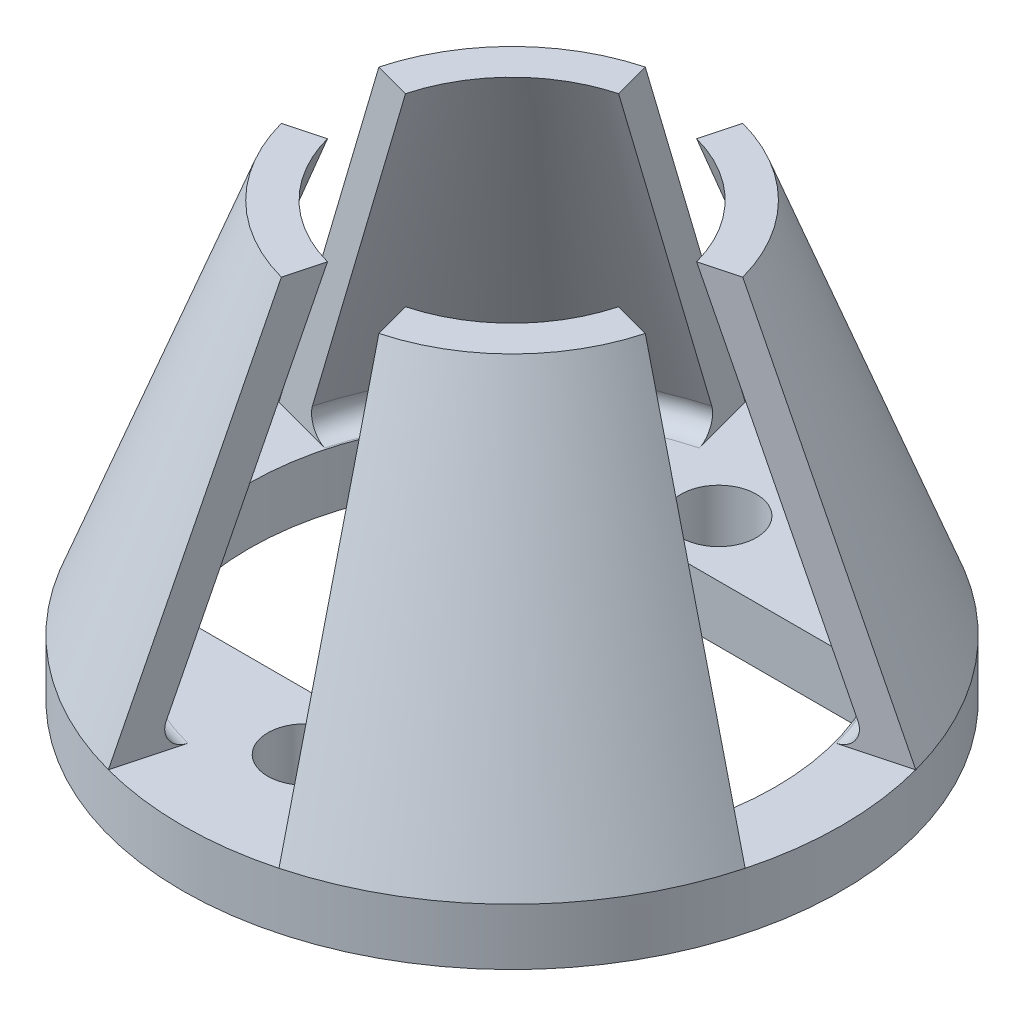
ISO-10303-21;
HEADER;
FILE_DESCRIPTION(('STEP AP214'),'2;1');
FILE_NAME('part.step','',(''),(''),'','','');
FILE_SCHEMA(('AUTOMOTIVE_DESIGN { 1 0 10303 214 1 1 1 1 }'));
ENDSEC;
DATA;
#1=APPLICATION_CONTEXT('core data for automotive mechanical design processes');
#2=APPLICATION_PROTOCOL_DEFINITION('international standard','automotive_design',2000,#1);
#3=PRODUCT_CONTEXT('',#1,'mechanical');
#4=PRODUCT('Part','Part','',(#3));
#5=PRODUCT_RELATED_PRODUCT_CATEGORY('part','',(#4));
#6=PRODUCT_DEFINITION_FORMATION('','',#4);
#7=PRODUCT_DEFINITION_CONTEXT('part definition',#1,'design');
#8=PRODUCT_DEFINITION('design','',#6,#7);
#9=PRODUCT_DEFINITION_SHAPE('','',#8);
#10=(LENGTH_UNIT() NAMED_UNIT(*) SI_UNIT(.MILLI.,.METRE.));
#11=(NAMED_UNIT(*) PLANE_ANGLE_UNIT() SI_UNIT($,.RADIAN.));
#12=(NAMED_UNIT(*) SI_UNIT($,.STERADIAN.) SOLID_ANGLE_UNIT());
#13=UNCERTAINTY_MEASURE_WITH_UNIT(LENGTH_MEASURE(1.E-05),#10,'distance_accuracy_value','');
#14=(GEOMETRIC_REPRESENTATION_CONTEXT(3) GLOBAL_UNCERTAINTY_ASSIGNED_CONTEXT((#13)) GLOBAL_UNIT_ASSIGNED_CONTEXT((#10,
#11,#12)) REPRESENTATION_CONTEXT('',''));
#15=CARTESIAN_POINT('',(0.,0.,0.));
#16=DIRECTION('',(0.,0.,1.));
#17=DIRECTION('',(1.,0.,0.));
#18=AXIS2_PLACEMENT_3D('',#15,#16,#17);
#19=CARTESIAN_POINT('',(0.,3.,0.));
#20=DIRECTION('',(0.,1.,0.));
#21=DIRECTION('',(0.,0.,1.));
#22=AXIS2_PLACEMENT_3D('',#19,#20,#21);
#23=PLANE('',#22);
#24=CARTESIAN_POINT('',(0.,3.,0.));
#25=DIRECTION('',(0.,1.,0.));
#26=DIRECTION('',(0.,0.,1.));
#27=AXIS2_PLACEMENT_3D('',#24,#25,#26);
#28=CIRCLE('',#27,13.97);
#29=CARTESIAN_POINT('',(11.4734476074108,3.,7.97));
#30=VERTEX_POINT('',#29);
#31=CARTESIAN_POINT('',(11.4734476074108,3.,-7.97));
#32=VERTEX_POINT('',#31);
#33=EDGE_CURVE('E930',#30,#32,#28,.T.);
#34=ORIENTED_EDGE('',*,*,#33,.F.);
#35=DIRECTION('',(1.,0.,0.));
#36=VECTOR('',#35,1.);
#37=CARTESIAN_POINT('',(0.,3.,7.97));
#38=LINE('',#37,#36);
#39=CARTESIAN_POINT('',(-11.4734476074108,3.,7.97));
#40=VERTEX_POINT('',#39);
#41=EDGE_CURVE('E953',#40,#30,#38,.T.);
#42=ORIENTED_EDGE('',*,*,#41,.F.);
#43=CARTESIAN_POINT('',(-11.4734476074108,3.,-7.97));
#44=VERTEX_POINT('',#43);
#45=EDGE_CURVE('E952',#44,#40,#28,.T.);
#46=ORIENTED_EDGE('',*,*,#45,.F.);
#47=DIRECTION('',(1.,0.,0.));
#48=VECTOR('',#47,1.);
#49=CARTESIAN_POINT('',(0.,3.,-7.97));
#50=LINE('',#49,#48);
#51=EDGE_CURVE('E949',#44,#32,#50,.T.);
#52=ORIENTED_EDGE('',*,*,#51,.T.);
#53=EDGE_LOOP('',(#34,#42,#46,#52));
#54=FACE_BOUND('',#53,.T.);
#55=CARTESIAN_POINT('',(0.,3.,-10.97));
#56=DIRECTION('',(0.,1.,0.));
#57=DIRECTION('',(0.,0.,1.));
#58=AXIS2_PLACEMENT_3D('',#55,#56,#57);
#59=CIRCLE('',#58,2.);
#60=CARTESIAN_POINT('',(0.,3.,-8.97));
#61=VERTEX_POINT('',#60);
#62=EDGE_CURVE('E651',#61,#61,#59,.T.);
#63=ORIENTED_EDGE('',*,*,#62,.F.);
#64=EDGE_LOOP('',(#63));
#65=FACE_BOUND('',#64,.T.);
#66=CARTESIAN_POINT('',(0.,3.,10.97));
#67=DIRECTION('',(0.,1.,0.));
#68=DIRECTION('',(0.,0.,1.));
#69=AXIS2_PLACEMENT_3D('',#66,#67,#68);
#70=CIRCLE('',#69,2.);
#71=CARTESIAN_POINT('',(0.,3.,12.97));
#72=VERTEX_POINT('',#71);
#73=EDGE_CURVE('E925',#72,#72,#70,.T.);
#74=ORIENTED_EDGE('',*,*,#73,.F.);
#75=EDGE_LOOP('',(#74));
#76=FACE_BOUND('',#75,.T.);
#77=CARTESIAN_POINT('',(0.,3.,0.));
#78=DIRECTION('',(0.,1.,0.));
#79=DIRECTION('',(0.,0.,1.));
#80=AXIS2_PLACEMENT_3D('',#77,#78,#79);
#81=CIRCLE('',#80,14.0569995318353);
#82=CARTESIAN_POINT('',(13.5780188879331,3.,-3.63821919583621));
#83=VERTEX_POINT('',#82);
#84=CARTESIAN_POINT('',(3.6382191958362,3.,-13.5780188879331));
#85=VERTEX_POINT('',#84);
#86=EDGE_CURVE('E872',#83,#85,#81,.T.);
#87=ORIENTED_EDGE('',*,*,#86,.T.);
#88=DIRECTION('',(0.258819045102521,0.,-0.965925826289068));
#89=VECTOR('',#88,1.);
#90=CARTESIAN_POINT('',(0.,3.,0.));
#91=LINE('',#90,#89);
#92=CARTESIAN_POINT('',(4.52933328929412,3.,-16.9037019600587));
#93=VERTEX_POINT('',#92);
#94=EDGE_CURVE('E654',#85,#93,#91,.T.);
#95=ORIENTED_EDGE('',*,*,#94,.T.);
#96=CARTESIAN_POINT('',(0.,3.,0.));
#97=DIRECTION('',(0.,1.,0.));
#98=DIRECTION('',(0.,0.,1.));
#99=AXIS2_PLACEMENT_3D('',#96,#97,#98);
#100=CIRCLE('',#99,17.5);
#101=CARTESIAN_POINT('',(-4.52933328929412,3.,-16.9037019600587));
#102=VERTEX_POINT('',#101);
#103=EDGE_CURVE('E632',#93,#102,#100,.T.);
#104=ORIENTED_EDGE('',*,*,#103,.T.);
#105=DIRECTION('',(0.258819045102521,0.,0.965925826289068));
#106=VECTOR('',#105,1.);
#107=CARTESIAN_POINT('',(0.,3.,0.));
#108=LINE('',#107,#106);
#109=CARTESIAN_POINT('',(-3.6382191958362,3.,-13.5780188879331));
#110=VERTEX_POINT('',#109);
#111=EDGE_CURVE('E690',#110,#102,#108,.F.);
#112=ORIENTED_EDGE('',*,*,#111,.F.);
#113=CARTESIAN_POINT('',(0.,3.,0.));
#114=DIRECTION('',(0.,1.,0.));
#115=DIRECTION('',(0.,0.,1.));
#116=AXIS2_PLACEMENT_3D('',#113,#114,#115);
#117=CIRCLE('',#116,14.0569995318353);
#118=CARTESIAN_POINT('',(-13.5780188879331,3.,-3.63821919583621));
#119=VERTEX_POINT('',#118);
#120=EDGE_CURVE('E874',#110,#119,#117,.T.);
#121=ORIENTED_EDGE('',*,*,#120,.T.);
#122=DIRECTION('',(-0.965925826289068,0.,-0.258819045102521));
#123=VECTOR('',#122,1.);
#124=CARTESIAN_POINT('',(-14.9718503074806,3.,-4.01169519908908));
#125=LINE('',#124,#123);
#126=CARTESIAN_POINT('',(-16.9037019600587,3.,-4.52933328929413));
#127=VERTEX_POINT('',#126);
#128=EDGE_CURVE('E709',#119,#127,#125,.T.);
#129=ORIENTED_EDGE('',*,*,#128,.T.);
#130=CARTESIAN_POINT('',(-16.9037019600587,3.,4.52933328929412));
#131=VERTEX_POINT('',#130);
#132=EDGE_CURVE('E323',#127,#131,#100,.T.);
#133=ORIENTED_EDGE('',*,*,#132,.T.);
#134=DIRECTION('',(0.965925826289068,0.,-0.258819045102521));
#135=VECTOR('',#134,1.);
#136=CARTESIAN_POINT('',(0.,3.,0.));
#137=LINE('',#136,#135);
#138=CARTESIAN_POINT('',(-13.5780188879331,3.,3.6382191958362));
#139=VERTEX_POINT('',#138);
#140=EDGE_CURVE('E344',#139,#131,#137,.F.);
#141=ORIENTED_EDGE('',*,*,#140,.F.);
#142=CARTESIAN_POINT('',(0.,3.,0.));
#143=DIRECTION('',(0.,1.,0.));
#144=DIRECTION('',(0.,0.,1.));
#145=AXIS2_PLACEMENT_3D('',#142,#143,#144);
#146=CIRCLE('',#145,14.0569995318353);
#147=CARTESIAN_POINT('',(-3.6382191958362,3.,13.5780188879331));
#148=VERTEX_POINT('',#147);
#149=EDGE_CURVE('E330',#139,#148,#146,.T.);
#150=ORIENTED_EDGE('',*,*,#149,.T.);
#151=DIRECTION('',(-0.258819045102522,0.,0.965925826289068));
#152=VECTOR('',#151,1.);
#153=CARTESIAN_POINT('',(-4.01169519908908,3.,14.9718503074806));
#154=LINE('',#153,#152);
#155=CARTESIAN_POINT('',(-4.52933328929412,3.,16.9037019600587));
#156=VERTEX_POINT('',#155);
#157=EDGE_CURVE('E327',#148,#156,#154,.T.);
#158=ORIENTED_EDGE('',*,*,#157,.T.);
#159=CARTESIAN_POINT('',(4.52933328929412,3.,16.9037019600587));
#160=VERTEX_POINT('',#159);
#161=EDGE_CURVE('E309',#156,#160,#100,.T.);
#162=ORIENTED_EDGE('',*,*,#161,.T.);
#163=DIRECTION('',(0.258819045102521,0.,0.965925826289068));
#164=VECTOR('',#163,1.);
#165=CARTESIAN_POINT('',(0.,3.,0.));
#166=LINE('',#165,#164);
#167=CARTESIAN_POINT('',(3.6382191958362,3.,13.5780188879331));
#168=VERTEX_POINT('',#167);
#169=EDGE_CURVE('E608',#168,#160,#166,.T.);
#170=ORIENTED_EDGE('',*,*,#169,.F.);
#171=CARTESIAN_POINT('',(0.,3.,0.));
#172=DIRECTION('',(0.,1.,0.));
#173=DIRECTION('',(0.,0.,1.));
#174=AXIS2_PLACEMENT_3D('',#171,#172,#173);
#175=CIRCLE('',#174,14.0569995318353);
#176=CARTESIAN_POINT('',(13.5780188879331,3.,3.6382191958362));
#177=VERTEX_POINT('',#176);
#178=EDGE_CURVE('E894',#168,#177,#175,.T.);
#179=ORIENTED_EDGE('',*,*,#178,.T.);
#180=DIRECTION('',(0.965925826289068,0.,0.258819045102521));
#181=VECTOR('',#180,1.);
#182=CARTESIAN_POINT('',(0.,3.,0.));
#183=LINE('',#182,#181);
#184=CARTESIAN_POINT('',(16.9037019600587,3.,4.52933328929412));
#185=VERTEX_POINT('',#184);
#186=EDGE_CURVE('E483',#177,#185,#183,.T.);
#187=ORIENTED_EDGE('',*,*,#186,.T.);
#188=CARTESIAN_POINT('',(16.9037019600587,3.,-4.52933328929413));
#189=VERTEX_POINT('',#188);
#190=EDGE_CURVE('E324',#185,#189,#100,.T.);
#191=ORIENTED_EDGE('',*,*,#190,.T.);
#192=DIRECTION('',(0.965925826289068,0.,-0.258819045102521));
#193=VECTOR('',#192,1.);
#194=CARTESIAN_POINT('',(0.,3.,0.));
#195=LINE('',#194,#193);
#196=EDGE_CURVE('E603',#83,#189,#195,.T.);
#197=ORIENTED_EDGE('',*,*,#196,.F.);
#198=EDGE_LOOP('',(#87,#95,#104,#112,#121,#129,#133,#141,#150,#158,#162,#170,#179,#187,#191,#197));
#199=FACE_BOUND('',#198,.T.);
#200=ADVANCED_FACE('F149',(#54,#65,#76,#199),#23,.T.);
#201=CARTESIAN_POINT('',(0.,1.5,7.97));
#202=DIRECTION('',(0.,0.,-1.));
#203=DIRECTION('',(-1.,0.,0.));
#204=AXIS2_PLACEMENT_3D('',#201,#202,#203);
#205=PLANE('',#204);
#206=DIRECTION('',(1.,0.,0.));
#207=VECTOR('',#206,1.);
#208=CARTESIAN_POINT('',(0.,0.,7.97));
#209=LINE('',#208,#207);
#210=CARTESIAN_POINT('',(-11.4734476074108,0.,7.97));
#211=VERTEX_POINT('',#210);
#212=CARTESIAN_POINT('',(11.4734476074108,0.,7.97));
#213=VERTEX_POINT('',#212);
#214=EDGE_CURVE('E908',#211,#213,#209,.T.);
#215=ORIENTED_EDGE('',*,*,#214,.F.);
#216=DIRECTION('',(0.,-1.,0.));
#217=VECTOR('',#216,1.);
#218=CARTESIAN_POINT('',(-11.4734476074108,1.5,7.97));
#219=LINE('',#218,#217);
#220=EDGE_CURVE('E637',#40,#211,#219,.T.);
#221=ORIENTED_EDGE('',*,*,#220,.F.);
#222=ORIENTED_EDGE('',*,*,#41,.T.);
#223=DIRECTION('',(0.,-1.,0.));
#224=VECTOR('',#223,1.);
#225=CARTESIAN_POINT('',(11.4734476074108,1.5,7.97));
#226=LINE('',#225,#224);
#227=EDGE_CURVE('E902',#30,#213,#226,.T.);
#228=ORIENTED_EDGE('',*,*,#227,.T.);
#229=EDGE_LOOP('',(#215,#221,#222,#228));
#230=FACE_BOUND('',#229,.T.);
#231=ADVANCED_FACE('F752',(#230),#205,.T.);
#232=CARTESIAN_POINT('',(0.,1.5,10.97));
#233=DIRECTION('',(0.,-1.,0.));
#234=DIRECTION('',(0.,0.,-1.));
#235=AXIS2_PLACEMENT_3D('',#232,#233,#234);
#236=CYLINDRICAL_SURFACE('',#235,2.);
#237=CARTESIAN_POINT('',(0.,0.,10.97));
#238=DIRECTION('',(0.,1.,0.));
#239=DIRECTION('',(0.,0.,1.));
#240=AXIS2_PLACEMENT_3D('',#237,#238,#239);
#241=CIRCLE('',#240,2.);
#242=CARTESIAN_POINT('',(0.,0.,12.97));
#243=VERTEX_POINT('',#242);
#244=EDGE_CURVE('E913',#243,#243,#241,.T.);
#245=ORIENTED_EDGE('',*,*,#244,.F.);
#246=EDGE_LOOP('',(#245));
#247=FACE_BOUND('',#246,.T.);
#248=ORIENTED_EDGE('',*,*,#73,.T.);
#249=EDGE_LOOP('',(#248));
#250=FACE_BOUND('',#249,.T.);
#251=ADVANCED_FACE('F750',(#247,#250),#236,.F.);
#252=CARTESIAN_POINT('',(0.,0.,0.));
#253=DIRECTION('',(0.,1.,0.));
#254=DIRECTION('',(0.,0.,1.));
#255=AXIS2_PLACEMENT_3D('',#252,#253,#254);
#256=PLANE('',#255);
#257=CARTESIAN_POINT('',(0.,0.,0.));
#258=DIRECTION('',(0.,1.,0.));
#259=DIRECTION('',(0.,0.,1.));
#260=AXIS2_PLACEMENT_3D('',#257,#258,#259);
#261=CIRCLE('',#260,13.97);
#262=CARTESIAN_POINT('',(11.4734476074108,0.,-7.97));
#263=VERTEX_POINT('',#262);
#264=EDGE_CURVE('E830',#213,#263,#261,.T.);
#265=ORIENTED_EDGE('',*,*,#264,.T.);
#266=DIRECTION('',(1.,0.,0.));
#267=VECTOR('',#266,1.);
#268=CARTESIAN_POINT('',(0.,0.,-7.97));
#269=LINE('',#268,#267);
#270=CARTESIAN_POINT('',(-11.4734476074108,0.,-7.97));
#271=VERTEX_POINT('',#270);
#272=EDGE_CURVE('E935',#271,#263,#269,.T.);
#273=ORIENTED_EDGE('',*,*,#272,.F.);
#274=EDGE_CURVE('E939',#271,#211,#261,.T.);
#275=ORIENTED_EDGE('',*,*,#274,.T.);
#276=ORIENTED_EDGE('',*,*,#214,.T.);
#277=EDGE_LOOP('',(#265,#273,#275,#276));
#278=FACE_BOUND('',#277,.T.);
#279=ORIENTED_EDGE('',*,*,#244,.T.);
#280=EDGE_LOOP('',(#279));
#281=FACE_BOUND('',#280,.T.);
#282=CARTESIAN_POINT('',(0.,0.,0.));
#283=DIRECTION('',(0.,1.,0.));
#284=DIRECTION('',(0.,0.,1.));
#285=AXIS2_PLACEMENT_3D('',#282,#283,#284);
#286=CIRCLE('',#285,17.5);
#287=CARTESIAN_POINT('',(0.,0.,17.5));
#288=VERTEX_POINT('',#287);
#289=EDGE_CURVE('E931',#288,#288,#286,.T.);
#290=ORIENTED_EDGE('',*,*,#289,.F.);
#291=EDGE_LOOP('',(#290));
#292=FACE_BOUND('',#291,.T.);
#293=CARTESIAN_POINT('',(0.,0.,-10.97));
#294=DIRECTION('',(0.,1.,0.));
#295=DIRECTION('',(0.,0.,1.));
#296=AXIS2_PLACEMENT_3D('',#293,#294,#295);
#297=CIRCLE('',#296,2.);
#298=CARTESIAN_POINT('',(0.,0.,-8.97));
#299=VERTEX_POINT('',#298);
#300=EDGE_CURVE('E926',#299,#299,#297,.T.);
#301=ORIENTED_EDGE('',*,*,#300,.T.);
#302=EDGE_LOOP('',(#301));
#303=FACE_BOUND('',#302,.T.);
#304=ADVANCED_FACE('F747',(#278,#281,#292,#303),#256,.F.);
#305=CARTESIAN_POINT('',(0.,3.,0.));
#306=DIRECTION('',(0.,-1.,0.));
#307=DIRECTION('',(0.,0.,-1.));
#308=AXIS2_PLACEMENT_3D('',#305,#306,#307);
#309=CYLINDRICAL_SURFACE('',#308,13.97);
#310=ORIENTED_EDGE('',*,*,#264,.F.);
#311=ORIENTED_EDGE('',*,*,#227,.F.);
#312=ORIENTED_EDGE('',*,*,#33,.T.);
#313=DIRECTION('',(0.,-1.,0.));
#314=VECTOR('',#313,1.);
#315=CARTESIAN_POINT('',(11.4734476074108,3.,-7.97));
#316=LINE('',#315,#314);
#317=EDGE_CURVE('E922',#32,#263,#316,.T.);
#318=ORIENTED_EDGE('',*,*,#317,.T.);
#319=EDGE_LOOP('',(#310,#311,#312,#318));
#320=FACE_BOUND('',#319,.T.);
#321=ADVANCED_FACE('F745',(#320),#309,.F.);
#322=ORIENTED_EDGE('',*,*,#274,.F.);
#323=DIRECTION('',(0.,-1.,0.));
#324=VECTOR('',#323,1.);
#325=CARTESIAN_POINT('',(-11.4734476074108,3.,-7.97));
#326=LINE('',#325,#324);
#327=EDGE_CURVE('E919',#44,#271,#326,.T.);
#328=ORIENTED_EDGE('',*,*,#327,.F.);
#329=ORIENTED_EDGE('',*,*,#45,.T.);
#330=ORIENTED_EDGE('',*,*,#220,.T.);
#331=EDGE_LOOP('',(#322,#328,#329,#330));
#332=FACE_BOUND('',#331,.T.);
#333=ADVANCED_FACE('F742',(#332),#309,.F.);
#334=CARTESIAN_POINT('',(0.,3.,-10.97));
#335=DIRECTION('',(0.,-1.,0.));
#336=DIRECTION('',(0.,0.,-1.));
#337=AXIS2_PLACEMENT_3D('',#334,#335,#336);
#338=CYLINDRICAL_SURFACE('',#337,2.);
#339=ORIENTED_EDGE('',*,*,#62,.T.);
#340=EDGE_LOOP('',(#339));
#341=FACE_BOUND('',#340,.T.);
#342=ORIENTED_EDGE('',*,*,#300,.F.);
#343=EDGE_LOOP('',(#342));
#344=FACE_BOUND('',#343,.T.);
#345=ADVANCED_FACE('F735',(#341,#344),#338,.F.);
#346=CARTESIAN_POINT('',(0.,3.,0.));
#347=DIRECTION('',(0.,-1.,0.));
#348=DIRECTION('',(0.,0.,-1.));
#349=AXIS2_PLACEMENT_3D('',#346,#347,#348);
#350=CYLINDRICAL_SURFACE('',#349,17.5);
#351=CARTESIAN_POINT('',(0.,3.,0.));
#352=DIRECTION('',(0.,-1.,0.));
#353=DIRECTION('',(0.,0.,-1.));
#354=AXIS2_PLACEMENT_3D('',#351,#352,#353);
#355=CIRCLE('',#354,17.5);
#356=EDGE_CURVE('E648',#189,#93,#355,.F.);
#357=ORIENTED_EDGE('',*,*,#356,.F.);
#358=ORIENTED_EDGE('',*,*,#190,.F.);
#359=CARTESIAN_POINT('',(0.,3.,0.));
#360=DIRECTION('',(0.,1.,0.));
#361=DIRECTION('',(0.,0.,1.));
#362=AXIS2_PLACEMENT_3D('',#359,#360,#361);
#363=CIRCLE('',#362,17.5);
#364=EDGE_CURVE('E319',#160,#185,#363,.T.);
#365=ORIENTED_EDGE('',*,*,#364,.F.);
#366=ORIENTED_EDGE('',*,*,#161,.F.);
#367=CARTESIAN_POINT('',(0.,3.,0.));
#368=DIRECTION('',(0.,1.,0.));
#369=DIRECTION('',(-0.965925826289068,0.,0.258819045102521));
#370=AXIS2_PLACEMENT_3D('',#367,#368,#369);
#371=CIRCLE('',#370,17.5);
#372=EDGE_CURVE('E315',#131,#156,#371,.T.);
#373=ORIENTED_EDGE('',*,*,#372,.F.);
#374=ORIENTED_EDGE('',*,*,#132,.F.);
#375=CARTESIAN_POINT('',(0.,3.,0.));
#376=DIRECTION('',(0.,1.,0.));
#377=DIRECTION('',(-0.258819045102521,0.,-0.965925826289068));
#378=AXIS2_PLACEMENT_3D('',#375,#376,#377);
#379=CIRCLE('',#378,17.5);
#380=EDGE_CURVE('E686',#102,#127,#379,.T.);
#381=ORIENTED_EDGE('',*,*,#380,.F.);
#382=ORIENTED_EDGE('',*,*,#103,.F.);
#383=EDGE_LOOP('',(#357,#358,#365,#366,#373,#374,#381,#382));
#384=FACE_BOUND('',#383,.T.);
#385=ORIENTED_EDGE('',*,*,#289,.T.);
#386=EDGE_LOOP('',(#385));
#387=FACE_BOUND('',#386,.T.);
#388=ADVANCED_FACE('F312',(#384,#387),#350,.T.);
#389=CARTESIAN_POINT('',(0.,3.,-7.97));
#390=DIRECTION('',(0.,0.,-1.));
#391=DIRECTION('',(-1.,0.,0.));
#392=AXIS2_PLACEMENT_3D('',#389,#390,#391);
#393=PLANE('',#392);
#394=ORIENTED_EDGE('',*,*,#327,.T.);
#395=ORIENTED_EDGE('',*,*,#272,.T.);
#396=ORIENTED_EDGE('',*,*,#317,.F.);
#397=ORIENTED_EDGE('',*,*,#51,.F.);
#398=EDGE_LOOP('',(#394,#395,#396,#397));
#399=FACE_BOUND('',#398,.T.);
#400=ADVANCED_FACE('F734',(#399),#393,.F.);
#401=CARTESIAN_POINT('',(0.,23.,0.));
#402=DIRECTION('',(0.,1.,0.));
#403=DIRECTION('',(0.,0.,1.));
#404=AXIS2_PLACEMENT_3D('',#401,#402,#403);
#405=PLANE('',#404);
#406=DIRECTION('',(0.965925826289068,0.,-0.258819045102521));
#407=VECTOR('',#406,1.);
#408=CARTESIAN_POINT('',(0.,23.,0.));
#409=LINE('',#408,#407);
#410=CARTESIAN_POINT('',(7.72740661031255,23.,-2.07055236082017));
#411=VERTEX_POINT('',#410);
#412=CARTESIAN_POINT('',(9.65925826289068,23.,-2.58819045102522));
#413=VERTEX_POINT('',#412);
#414=EDGE_CURVE('E813',#411,#413,#409,.T.);
#415=ORIENTED_EDGE('',*,*,#414,.T.);
#416=CARTESIAN_POINT('',(0.,23.,0.));
#417=DIRECTION('',(0.,1.,0.));
#418=DIRECTION('',(0.,0.,1.));
#419=AXIS2_PLACEMENT_3D('',#416,#417,#418);
#420=CIRCLE('',#419,10.);
#421=CARTESIAN_POINT('',(2.5881904510252,23.,-9.65925826289068));
#422=VERTEX_POINT('',#421);
#423=EDGE_CURVE('E678',#413,#422,#420,.T.);
#424=ORIENTED_EDGE('',*,*,#423,.T.);
#425=DIRECTION('',(0.258819045102521,0.,-0.965925826289068));
#426=VECTOR('',#425,1.);
#427=CARTESIAN_POINT('',(0.,23.,0.));
#428=LINE('',#427,#426);
#429=CARTESIAN_POINT('',(2.07055236082017,23.,-7.72740661031255));
#430=VERTEX_POINT('',#429);
#431=EDGE_CURVE('E812',#430,#422,#428,.T.);
#432=ORIENTED_EDGE('',*,*,#431,.F.);
#433=CARTESIAN_POINT('',(0.,23.,0.));
#434=DIRECTION('',(0.,1.,0.));
#435=DIRECTION('',(0.,0.,1.));
#436=AXIS2_PLACEMENT_3D('',#433,#434,#435);
#437=CIRCLE('',#436,8.);
#438=EDGE_CURVE('E817',#411,#430,#437,.T.);
#439=ORIENTED_EDGE('',*,*,#438,.F.);
#440=EDGE_LOOP('',(#415,#424,#432,#439));
#441=FACE_BOUND('',#440,.T.);
#442=ADVANCED_FACE('F740',(#441),#405,.T.);
#443=CARTESIAN_POINT('',(0.,3.,0.));
#444=DIRECTION('',(0.,-1.,0.));
#445=DIRECTION('',(0.,0.,-1.));
#446=AXIS2_PLACEMENT_3D('',#443,#444,#445);
#447=CONICAL_SURFACE('',#446,17.5,0.358770670270573);
#448=DIRECTION('',(-0.0908774338650183,0.936329177569044,0.339159200445729));
#449=VECTOR('',#448,1.);
#450=CARTESIAN_POINT('',(4.52933328929411,3.,-16.9037019600587));
#451=LINE('',#450,#449);
#452=EDGE_CURVE('E657',#93,#422,#451,.T.);
#453=ORIENTED_EDGE('',*,*,#452,.T.);
#454=ORIENTED_EDGE('',*,*,#423,.F.);
#455=DIRECTION('',(-0.339159200445729,0.936329177569044,0.0908774338650185));
#456=VECTOR('',#455,1.);
#457=CARTESIAN_POINT('',(16.9037019600587,3.,-4.52933328929413));
#458=LINE('',#457,#456);
#459=EDGE_CURVE('E663',#189,#413,#458,.T.);
#460=ORIENTED_EDGE('',*,*,#459,.F.);
#461=ORIENTED_EDGE('',*,*,#356,.T.);
#462=EDGE_LOOP('',(#453,#454,#460,#461));
#463=FACE_BOUND('',#462,.T.);
#464=ADVANCED_FACE('F583',(#463),#447,.T.);
#465=CARTESIAN_POINT('',(0.,0.,0.));
#466=DIRECTION('',(-0.258819045102521,0.,-0.965925826289068));
#467=DIRECTION('',(-0.965925826289068,0.,0.258819045102521));
#468=AXIS2_PLACEMENT_3D('',#465,#466,#467);
#469=PLANE('',#468);
#470=ORIENTED_EDGE('',*,*,#459,.T.);
#471=ORIENTED_EDGE('',*,*,#414,.F.);
#472=DIRECTION('',(-0.339159200445729,0.936329177569045,0.0908774338650187));
#473=VECTOR('',#472,1.);
#474=CARTESIAN_POINT('',(14.9718503074806,3.,-4.01169519908909));
#475=LINE('',#474,#473);
#476=CARTESIAN_POINT('',(14.482443422455,4.35112344158839,-3.88055901947626));
#477=VERTEX_POINT('',#476);
#478=EDGE_CURVE('E867',#477,#411,#475,.T.);
#479=ORIENTED_EDGE('',*,*,#478,.F.);
#480=CARTESIAN_POINT('',(13.5780188879331,4.,-3.63821919583621));
#481=DIRECTION('',(-0.258819045102521,0.,-0.965925826289068));
#482=DIRECTION('',(-0.965925826289068,0.,0.258819045102521));
#483=AXIS2_PLACEMENT_3D('',#480,#481,#482);
#484=CIRCLE('',#483,1.);
#485=EDGE_CURVE('E673',#477,#83,#484,.T.);
#486=ORIENTED_EDGE('',*,*,#485,.T.);
#487=ORIENTED_EDGE('',*,*,#196,.T.);
#488=EDGE_LOOP('',(#470,#471,#479,#486,#487));
#489=FACE_BOUND('',#488,.T.);
#490=ADVANCED_FACE('F668',(#489),#469,.F.);
#491=CARTESIAN_POINT('',(0.,0.,0.));
#492=DIRECTION('',(-0.965925826289068,0.,-0.258819045102521));
#493=DIRECTION('',(-0.258819045102521,0.,0.965925826289068));
#494=AXIS2_PLACEMENT_3D('',#491,#492,#493);
#495=PLANE('',#494);
#496=ORIENTED_EDGE('',*,*,#94,.F.);
#497=CARTESIAN_POINT('',(3.6382191958362,4.,-13.5780188879331));
#498=DIRECTION('',(-0.965925826289068,0.,-0.258819045102521));
#499=DIRECTION('',(-0.258819045102521,0.,0.965925826289068));
#500=AXIS2_PLACEMENT_3D('',#497,#498,#499);
#501=CIRCLE('',#500,1.);
#502=CARTESIAN_POINT('',(3.88055901947625,4.35112344158839,-14.482443422455));
#503=VERTEX_POINT('',#502);
#504=EDGE_CURVE('E870',#85,#503,#501,.F.);
#505=ORIENTED_EDGE('',*,*,#504,.T.);
#506=DIRECTION('',(-0.0908774338650184,0.936329177569045,0.339159200445729));
#507=VECTOR('',#506,1.);
#508=CARTESIAN_POINT('',(4.01169519908908,3.,-14.9718503074806));
#509=LINE('',#508,#507);
#510=EDGE_CURVE('E682',#503,#430,#509,.T.);
#511=ORIENTED_EDGE('',*,*,#510,.T.);
#512=ORIENTED_EDGE('',*,*,#431,.T.);
#513=ORIENTED_EDGE('',*,*,#452,.F.);
#514=EDGE_LOOP('',(#496,#505,#511,#512,#513));
#515=FACE_BOUND('',#514,.T.);
#516=ADVANCED_FACE('F834',(#515),#495,.T.);
#517=CARTESIAN_POINT('',(0.,3.,0.));
#518=DIRECTION('',(0.,-1.,0.));
#519=DIRECTION('',(0.,0.,-1.));
#520=AXIS2_PLACEMENT_3D('',#517,#518,#519);
#521=CONICAL_SURFACE('',#520,15.5,0.358770670270572);
#522=ORIENTED_EDGE('',*,*,#510,.F.);
#523=CARTESIAN_POINT('',(0.,4.35112344158839,0.));
#524=DIRECTION('',(0.,1.,0.));
#525=DIRECTION('',(0.,0.,1.));
#526=AXIS2_PLACEMENT_3D('',#523,#524,#525);
#527=CIRCLE('',#526,14.9933287094044);
#528=EDGE_CURVE('E465',#503,#477,#527,.F.);
#529=ORIENTED_EDGE('',*,*,#528,.T.);
#530=ORIENTED_EDGE('',*,*,#478,.T.);
#531=ORIENTED_EDGE('',*,*,#438,.T.);
#532=EDGE_LOOP('',(#522,#529,#530,#531));
#533=FACE_BOUND('',#532,.T.);
#534=ADVANCED_FACE('F582',(#533),#521,.F.);
#535=CARTESIAN_POINT('',(0.,23.,0.));
#536=DIRECTION('',(0.,1.,0.));
#537=DIRECTION('',(0.,0.,1.));
#538=AXIS2_PLACEMENT_3D('',#535,#536,#537);
#539=PLANE('',#538);
#540=DIRECTION('',(0.258819045102521,0.,0.965925826289068));
#541=VECTOR('',#540,1.);
#542=CARTESIAN_POINT('',(0.,23.,0.));
#543=LINE('',#542,#541);
#544=CARTESIAN_POINT('',(2.07055236082017,23.,7.72740661031255));
#545=VERTEX_POINT('',#544);
#546=CARTESIAN_POINT('',(2.58819045102521,23.,9.65925826289068));
#547=VERTEX_POINT('',#546);
#548=EDGE_CURVE('E562',#545,#547,#543,.T.);
#549=ORIENTED_EDGE('',*,*,#548,.T.);
#550=CARTESIAN_POINT('',(0.,23.,0.));
#551=DIRECTION('',(0.,1.,0.));
#552=DIRECTION('',(0.,0.,1.));
#553=AXIS2_PLACEMENT_3D('',#550,#551,#552);
#554=CIRCLE('',#553,10.);
#555=CARTESIAN_POINT('',(9.65925826289068,23.,2.58819045102521));
#556=VERTEX_POINT('',#555);
#557=EDGE_CURVE('E551',#547,#556,#554,.T.);
#558=ORIENTED_EDGE('',*,*,#557,.T.);
#559=DIRECTION('',(0.965925826289068,0.,0.258819045102521));
#560=VECTOR('',#559,1.);
#561=CARTESIAN_POINT('',(0.,23.,0.));
#562=LINE('',#561,#560);
#563=CARTESIAN_POINT('',(7.72740661031255,23.,2.07055236082017));
#564=VERTEX_POINT('',#563);
#565=EDGE_CURVE('E533',#564,#556,#562,.T.);
#566=ORIENTED_EDGE('',*,*,#565,.F.);
#567=CARTESIAN_POINT('',(0.,23.,0.));
#568=DIRECTION('',(0.,1.,0.));
#569=DIRECTION('',(0.,0.,1.));
#570=AXIS2_PLACEMENT_3D('',#567,#568,#569);
#571=CIRCLE('',#570,8.);
#572=EDGE_CURVE('E491',#545,#564,#571,.T.);
#573=ORIENTED_EDGE('',*,*,#572,.F.);
#574=EDGE_LOOP('',(#549,#558,#566,#573));
#575=FACE_BOUND('',#574,.T.);
#576=ADVANCED_FACE('F573',(#575),#539,.T.);
#577=CARTESIAN_POINT('',(0.,0.,0.));
#578=DIRECTION('',(0.965925826289068,0.,-0.258819045102521));
#579=DIRECTION('',(-0.258819045102521,0.,-0.965925826289068));
#580=AXIS2_PLACEMENT_3D('',#577,#578,#579);
#581=PLANE('',#580);
#582=DIRECTION('',(-0.0908774338650185,0.936329177569044,-0.339159200445729));
#583=VECTOR('',#582,1.);
#584=CARTESIAN_POINT('',(4.52933328929412,3.,16.9037019600587));
#585=LINE('',#584,#583);
#586=EDGE_CURVE('E471',#160,#547,#585,.T.);
#587=ORIENTED_EDGE('',*,*,#586,.T.);
#588=ORIENTED_EDGE('',*,*,#548,.F.);
#589=DIRECTION('',(-0.0908774338650185,0.936329177569045,-0.339159200445729));
#590=VECTOR('',#589,1.);
#591=CARTESIAN_POINT('',(4.01169519908908,3.,14.9718503074806));
#592=LINE('',#591,#590);
#593=CARTESIAN_POINT('',(3.88055901947625,4.35112344158839,14.482443422455));
#594=VERTEX_POINT('',#593);
#595=EDGE_CURVE('E466',#594,#545,#592,.T.);
#596=ORIENTED_EDGE('',*,*,#595,.F.);
#597=CARTESIAN_POINT('',(3.6382191958362,4.,13.5780188879331));
#598=DIRECTION('',(0.965925826289068,0.,-0.258819045102521));
#599=DIRECTION('',(-0.258819045102521,0.,-0.965925826289068));
#600=AXIS2_PLACEMENT_3D('',#597,#598,#599);
#601=CIRCLE('',#600,1.);
#602=EDGE_CURVE('E610',#594,#168,#601,.T.);
#603=ORIENTED_EDGE('',*,*,#602,.T.);
#604=ORIENTED_EDGE('',*,*,#169,.T.);
#605=EDGE_LOOP('',(#587,#588,#596,#603,#604));
#606=FACE_BOUND('',#605,.T.);
#607=ADVANCED_FACE('F510',(#606),#581,.F.);
#608=CARTESIAN_POINT('',(0.,3.,0.));
#609=DIRECTION('',(0.,-1.,0.));
#610=DIRECTION('',(0.,0.,-1.));
#611=AXIS2_PLACEMENT_3D('',#608,#609,#610);
#612=CONICAL_SURFACE('',#611,15.5,0.358770670270572);
#613=DIRECTION('',(-0.339159200445729,0.936329177569045,-0.0908774338650184));
#614=VECTOR('',#613,1.);
#615=CARTESIAN_POINT('',(14.9718503074806,3.,4.01169519908908));
#616=LINE('',#615,#614);
#617=CARTESIAN_POINT('',(14.482443422455,4.35112344158839,3.88055901947625));
#618=VERTEX_POINT('',#617);
#619=EDGE_CURVE('E472',#618,#564,#616,.T.);
#620=ORIENTED_EDGE('',*,*,#619,.F.);
#621=CARTESIAN_POINT('',(0.,4.35112344158839,0.));
#622=DIRECTION('',(0.,1.,0.));
#623=DIRECTION('',(0.,0.,1.));
#624=AXIS2_PLACEMENT_3D('',#621,#622,#623);
#625=CIRCLE('',#624,14.9933287094044);
#626=EDGE_CURVE('E464',#618,#594,#625,.F.);
#627=ORIENTED_EDGE('',*,*,#626,.T.);
#628=ORIENTED_EDGE('',*,*,#595,.T.);
#629=ORIENTED_EDGE('',*,*,#572,.T.);
#630=EDGE_LOOP('',(#620,#627,#628,#629));
#631=FACE_BOUND('',#630,.T.);
#632=ADVANCED_FACE('F499',(#631),#612,.F.);
#633=CARTESIAN_POINT('',(0.,3.,0.));
#634=DIRECTION('',(0.,-1.,0.));
#635=DIRECTION('',(0.,0.,-1.));
#636=AXIS2_PLACEMENT_3D('',#633,#634,#635);
#637=CONICAL_SURFACE('',#636,17.5,0.358770670270572);
#638=DIRECTION('',(-0.339159200445729,0.936329177569044,-0.0908774338650183));
#639=VECTOR('',#638,1.);
#640=CARTESIAN_POINT('',(16.9037019600587,3.,4.52933328929411));
#641=LINE('',#640,#639);
#642=EDGE_CURVE('E470',#185,#556,#641,.T.);
#643=ORIENTED_EDGE('',*,*,#642,.T.);
#644=ORIENTED_EDGE('',*,*,#557,.F.);
#645=ORIENTED_EDGE('',*,*,#586,.F.);
#646=ORIENTED_EDGE('',*,*,#364,.T.);
#647=EDGE_LOOP('',(#643,#644,#645,#646));
#648=FACE_BOUND('',#647,.T.);
#649=ADVANCED_FACE('F509',(#648),#637,.T.);
#650=CARTESIAN_POINT('',(0.,0.,0.));
#651=DIRECTION('',(0.258819045102521,0.,-0.965925826289068));
#652=DIRECTION('',(-0.965925826289068,0.,-0.258819045102521));
#653=AXIS2_PLACEMENT_3D('',#650,#651,#652);
#654=PLANE('',#653);
#655=ORIENTED_EDGE('',*,*,#186,.F.);
#656=CARTESIAN_POINT('',(13.5780188879331,4.,3.6382191958362));
#657=DIRECTION('',(0.258819045102521,0.,-0.965925826289068));
#658=DIRECTION('',(-0.965925826289068,0.,-0.258819045102521));
#659=AXIS2_PLACEMENT_3D('',#656,#657,#658);
#660=CIRCLE('',#659,1.);
#661=EDGE_CURVE('E1314',#177,#618,#660,.F.);
#662=ORIENTED_EDGE('',*,*,#661,.T.);
#663=ORIENTED_EDGE('',*,*,#619,.T.);
#664=ORIENTED_EDGE('',*,*,#565,.T.);
#665=ORIENTED_EDGE('',*,*,#642,.F.);
#666=EDGE_LOOP('',(#655,#662,#663,#664,#665));
#667=FACE_BOUND('',#666,.T.);
#668=ADVANCED_FACE('F516',(#667),#654,.T.);
#669=CARTESIAN_POINT('',(0.,23.,0.));
#670=DIRECTION('',(0.,1.,0.));
#671=DIRECTION('',(0.,0.,1.));
#672=AXIS2_PLACEMENT_3D('',#669,#670,#671);
#673=PLANE('',#672);
#674=CARTESIAN_POINT('',(-7.72740661031255,23.,-2.07055236082017));
#675=DIRECTION('',(-0.965925826289068,0.,-0.258819045102522));
#676=VECTOR('',#675,1.);
#677=LINE('',#674,#676);
#678=CARTESIAN_POINT('',(-7.72740661031255,23.,-2.07055236082017));
#679=VERTEX_POINT('',#678);
#680=CARTESIAN_POINT('',(-9.65925826289068,23.,-2.58819045102522));
#681=VERTEX_POINT('',#680);
#682=EDGE_CURVE('E1302',#679,#681,#677,.T.);
#683=ORIENTED_EDGE('',*,*,#682,.F.);
#684=CARTESIAN_POINT('',(-7.72740661031254,23.,-2.07055236082017));
#685=CARTESIAN_POINT('',(-7.65955256748123,23.,-2.32378709616561));
#686=CARTESIAN_POINT('',(-7.57544103596084,23.,-2.5715157224253));
#687=CARTESIAN_POINT('',(-7.491064450868,23.,-2.82002499500308));
#688=CARTESIAN_POINT('',(-7.39103626009029,23.,-3.06146745892072));
#689=CARTESIAN_POINT('',(-7.29058704767288,23.,-3.30392616137334));
#690=CARTESIAN_POINT('',(-7.1749819322615,23.,-3.53830952175202));
#691=CARTESIAN_POINT('',(-7.05889023146924,23.,-3.77367940868947));
#692=CARTESIAN_POINT('',(-6.92820323027551,23.,-4.));
#693=CARTESIAN_POINT('',(-6.79696616359457,23.,-4.22727318143187));
#694=CARTESIAN_POINT('',(-6.65175689842036,23.,-4.44456186415682));
#695=CARTESIAN_POINT('',(-6.50593644311614,23.,-4.66276512143103));
#696=CARTESIAN_POINT('',(-6.34682672232988,23.,-4.87009143206977));
#697=CARTESIAN_POINT('',(-6.18704730398009,23.,-5.07829038533778));
#698=CARTESIAN_POINT('',(-6.01471845983182,23.,-5.27476652080055));
#699=CARTESIAN_POINT('',(-5.84166427843287,23.,-5.47206963018417));
#700=CARTESIAN_POINT('',(-5.65685424949238,23.,-5.65685424949238));
#701=CARTESIAN_POINT('',(-5.47126634961947,23.,-5.84241663278312));
#702=CARTESIAN_POINT('',(-5.27476652080055,23.,-6.01471845983182));
#703=CARTESIAN_POINT('',(-5.07743961833337,23.,-6.18774551041662));
#704=CARTESIAN_POINT('',(-4.87009143206976,23.,-6.34682672232988));
#705=CARTESIAN_POINT('',(-4.66187051109549,23.,-6.50657751181675));
#706=CARTESIAN_POINT('',(-4.44456186415682,23.,-6.65175689842036));
#707=CARTESIAN_POINT('',(-4.2263385586304,23.,-6.79754734939988));
#708=CARTESIAN_POINT('',(-4.,23.,-6.92820323027551));
#709=CARTESIAN_POINT('',(-3.77270877562033,23.,-7.0594090456537));
#710=CARTESIAN_POINT('',(-3.53830952175201,23.,-7.17498193226151));
#711=CARTESIAN_POINT('',(-3.30292367443016,23.,-7.2910412685975));
#712=CARTESIAN_POINT('',(-3.06146745892072,23.,-7.39103626009029));
#713=CARTESIAN_POINT('',(-2.81899494699208,23.,-7.4914521334874));
#714=CARTESIAN_POINT('',(-2.57151572242529,23.,-7.57544103596084));
#715=CARTESIAN_POINT('',(-2.32325526703591,23.,-7.65969507066704));
#716=CARTESIAN_POINT('',(-2.07055236082017,23.,-7.72740661031255));
#717=B_SPLINE_CURVE_WITH_KNOTS('',2,(#684,#685,#686,#687,#688,#689,#690,#691,#692,#693,#694,
#695,#696,#697,#698,#699,#700,#701,#702,#703,#704,#705,#706,#707,#708,#709,#710,#711,#712,#713,
#714,#715,#716),.UNSPECIFIED.,.F.,.F.,(3,2,2,2,2,2,2,2,2,2,2,2,2,2,2,2,3),(0.,0.0625,0.125,
0.1875,0.25,0.3125,0.375,0.4375,0.5,0.5625,0.625,0.6875,0.75,0.8125,0.875,0.9375,1.),.UNSPECIFIED.);
#718=CARTESIAN_POINT('',(-2.07055236082017,23.,-7.72740661031255));
#719=VERTEX_POINT('',#718);
#720=EDGE_CURVE('E614',#679,#719,#717,.T.);
#721=ORIENTED_EDGE('',*,*,#720,.T.);
#722=CARTESIAN_POINT('',(-2.07055236082017,23.,-7.72740661031255));
#723=DIRECTION('',(-0.258819045102521,0.,-0.965925826289068));
#724=VECTOR('',#723,1.);
#725=LINE('',#722,#724);
#726=CARTESIAN_POINT('',(-2.5881904510252,23.,-9.65925826289068));
#727=VERTEX_POINT('',#726);
#728=EDGE_CURVE('E620',#719,#727,#725,.T.);
#729=ORIENTED_EDGE('',*,*,#728,.T.);
#730=CARTESIAN_POINT('',(0.,23.,0.));
#731=DIRECTION('',(0.,-1.,0.));
#732=DIRECTION('',(-0.965925826289068,0.,-0.258819045102521));
#733=AXIS2_PLACEMENT_3D('',#730,#731,#732);
#734=CIRCLE('',#733,10.);
#735=EDGE_CURVE('E696',#681,#727,#734,.T.);
#736=ORIENTED_EDGE('',*,*,#735,.F.);
#737=EDGE_LOOP('',(#683,#721,#729,#736));
#738=FACE_BOUND('',#737,.T.);
#739=ADVANCED_FACE('F1054',(#738),#673,.T.);
#740=CARTESIAN_POINT('',(0.,3.,0.));
#741=DIRECTION('',(0.,-1.,0.));
#742=DIRECTION('',(0.,0.,-1.));
#743=AXIS2_PLACEMENT_3D('',#740,#741,#742);
#744=CONICAL_SURFACE('',#743,17.5,0.358770670270573);
#745=DIRECTION('',(0.0908774338650183,0.936329177569044,0.339159200445729));
#746=VECTOR('',#745,1.);
#747=CARTESIAN_POINT('',(-4.52933328929411,3.,-16.9037019600587));
#748=LINE('',#747,#746);
#749=EDGE_CURVE('E449',#102,#727,#748,.T.);
#750=ORIENTED_EDGE('',*,*,#749,.F.);
#751=ORIENTED_EDGE('',*,*,#380,.T.);
#752=DIRECTION('',(0.339159200445729,0.936329177569044,0.0908774338650185));
#753=VECTOR('',#752,1.);
#754=CARTESIAN_POINT('',(-16.9037019600587,3.,-4.52933328929413));
#755=LINE('',#754,#753);
#756=EDGE_CURVE('E457',#127,#681,#755,.T.);
#757=ORIENTED_EDGE('',*,*,#756,.T.);
#758=ORIENTED_EDGE('',*,*,#735,.T.);
#759=EDGE_LOOP('',(#750,#751,#757,#758));
#760=FACE_BOUND('',#759,.T.);
#761=ADVANCED_FACE('F420',(#760),#744,.T.);
#762=CARTESIAN_POINT('',(0.,0.,0.));
#763=DIRECTION('',(0.258819045102521,0.,-0.965925826289068));
#764=DIRECTION('',(0.965925826289068,0.,0.258819045102521));
#765=AXIS2_PLACEMENT_3D('',#762,#763,#764);
#766=PLANE('',#765);
#767=ORIENTED_EDGE('',*,*,#756,.F.);
#768=ORIENTED_EDGE('',*,*,#128,.F.);
#769=CARTESIAN_POINT('',(-13.5780188879331,4.,-3.63821919583621));
#770=DIRECTION('',(0.258819045102521,0.,-0.965925826289068));
#771=DIRECTION('',(-0.965925826289068,0.,-0.258819045102521));
#772=AXIS2_PLACEMENT_3D('',#769,#770,#771);
#773=CIRCLE('',#772,1.);
#774=CARTESIAN_POINT('',(-14.482443422455,4.35112344158839,-3.88055901947626));
#775=VERTEX_POINT('',#774);
#776=EDGE_CURVE('E1344',#119,#775,#773,.T.);
#777=ORIENTED_EDGE('',*,*,#776,.T.);
#778=DIRECTION('',(0.339159200445729,0.936329177569045,0.0908774338650187));
#779=VECTOR('',#778,1.);
#780=CARTESIAN_POINT('',(-14.9718503074806,3.,-4.01169519908909));
#781=LINE('',#780,#779);
#782=EDGE_CURVE('E456',#775,#679,#781,.T.);
#783=ORIENTED_EDGE('',*,*,#782,.T.);
#784=ORIENTED_EDGE('',*,*,#682,.T.);
#785=EDGE_LOOP('',(#767,#768,#777,#783,#784));
#786=FACE_BOUND('',#785,.T.);
#787=ADVANCED_FACE('F1062',(#786),#766,.F.);
#788=CARTESIAN_POINT('',(0.,0.,0.));
#789=DIRECTION('',(0.965925826289068,0.,-0.258819045102521));
#790=DIRECTION('',(0.258819045102521,0.,0.965925826289068));
#791=AXIS2_PLACEMENT_3D('',#788,#789,#790);
#792=PLANE('',#791);
#793=DIRECTION('',(0.0908774338650184,0.936329177569045,0.339159200445729));
#794=VECTOR('',#793,1.);
#795=CARTESIAN_POINT('',(-4.01169519908908,3.,-14.9718503074806));
#796=LINE('',#795,#794);
#797=CARTESIAN_POINT('',(-3.88055901947625,4.35112344158839,-14.482443422455));
#798=VERTEX_POINT('',#797);
#799=EDGE_CURVE('E452',#798,#719,#796,.T.);
#800=ORIENTED_EDGE('',*,*,#799,.F.);
#801=CARTESIAN_POINT('',(-3.6382191958362,4.,-13.5780188879331));
#802=DIRECTION('',(0.965925826289068,0.,-0.258819045102521));
#803=DIRECTION('',(-0.258819045102521,0.,-0.965925826289068));
#804=AXIS2_PLACEMENT_3D('',#801,#802,#803);
#805=CIRCLE('',#804,1.);
#806=EDGE_CURVE('E704',#798,#110,#805,.F.);
#807=ORIENTED_EDGE('',*,*,#806,.T.);
#808=ORIENTED_EDGE('',*,*,#111,.T.);
#809=ORIENTED_EDGE('',*,*,#749,.T.);
#810=ORIENTED_EDGE('',*,*,#728,.F.);
#811=EDGE_LOOP('',(#800,#807,#808,#809,#810));
#812=FACE_BOUND('',#811,.T.);
#813=ADVANCED_FACE('F703',(#812),#792,.T.);
#814=CARTESIAN_POINT('',(0.,3.,0.));
#815=DIRECTION('',(0.,-1.,0.));
#816=DIRECTION('',(0.,0.,-1.));
#817=AXIS2_PLACEMENT_3D('',#814,#815,#816);
#818=CONICAL_SURFACE('',#817,15.5,0.358770670270572);
#819=ORIENTED_EDGE('',*,*,#782,.F.);
#820=CARTESIAN_POINT('',(0.,4.35112344158839,0.));
#821=DIRECTION('',(0.,1.,0.));
#822=DIRECTION('',(0.,0.,1.));
#823=AXIS2_PLACEMENT_3D('',#820,#821,#822);
#824=CIRCLE('',#823,14.9933287094044);
#825=EDGE_CURVE('E460',#775,#798,#824,.F.);
#826=ORIENTED_EDGE('',*,*,#825,.T.);
#827=ORIENTED_EDGE('',*,*,#799,.T.);
#828=ORIENTED_EDGE('',*,*,#720,.F.);
#829=EDGE_LOOP('',(#819,#826,#827,#828));
#830=FACE_BOUND('',#829,.T.);
#831=ADVANCED_FACE('F419',(#830),#818,.F.);
#832=CARTESIAN_POINT('',(0.,23.,0.));
#833=DIRECTION('',(0.,1.,0.));
#834=DIRECTION('',(0.,0.,1.));
#835=AXIS2_PLACEMENT_3D('',#832,#833,#834);
#836=PLANE('',#835);
#837=CARTESIAN_POINT('',(-2.07055236082017,23.,7.72740661031255));
#838=DIRECTION('',(-0.258819045102521,0.,0.965925826289068));
#839=VECTOR('',#838,1.);
#840=LINE('',#837,#839);
#841=CARTESIAN_POINT('',(-2.07055236082017,23.,7.72740661031255));
#842=VERTEX_POINT('',#841);
#843=CARTESIAN_POINT('',(-2.58819045102521,23.,9.65925826289068));
#844=VERTEX_POINT('',#843);
#845=EDGE_CURVE('E337',#842,#844,#840,.T.);
#846=ORIENTED_EDGE('',*,*,#845,.F.);
#847=CARTESIAN_POINT('',(-2.07055236082017,23.,7.72740661031255));
#848=CARTESIAN_POINT('',(-2.32378709616886,23.,7.65955256748035));
#849=CARTESIAN_POINT('',(-2.5715157224253,23.,7.57544103596084));
#850=CARTESIAN_POINT('',(-2.82002499500877,23.,7.49106445086584));
#851=CARTESIAN_POINT('',(-3.06146745892072,23.,7.39103626009029));
#852=CARTESIAN_POINT('',(-3.30392616137652,23.,7.29058704767137));
#853=CARTESIAN_POINT('',(-3.53830952175201,23.,7.17498193226151));
#854=CARTESIAN_POINT('',(-3.77367940869263,23.,7.05889023146762));
#855=CARTESIAN_POINT('',(-4.,23.,6.92820323027551));
#856=CARTESIAN_POINT('',(-4.22727318143643,23.,6.79696616359173));
#857=CARTESIAN_POINT('',(-4.44456186415682,23.,6.65175689842036));
#858=CARTESIAN_POINT('',(-4.66276512143679,23.,6.50593644311208));
#859=CARTESIAN_POINT('',(-4.87009143206977,23.,6.34682672232988));
#860=CARTESIAN_POINT('',(-5.078290385343,23.,6.18704730397572));
#861=CARTESIAN_POINT('',(-5.27476652080055,23.,6.01471845983182));
#862=CARTESIAN_POINT('',(-5.47206963018584,23.,5.84166427843119));
#863=CARTESIAN_POINT('',(-5.65685424949238,23.,5.65685424949238));
#864=CARTESIAN_POINT('',(-5.84241663278312,23.,5.47126634961947));
#865=CARTESIAN_POINT('',(-6.01471845983182,23.,5.27476652080055));
#866=CARTESIAN_POINT('',(-6.18774551041663,23.,5.07743961833336));
#867=CARTESIAN_POINT('',(-6.34682672232988,23.,4.87009143206976));
#868=CARTESIAN_POINT('',(-6.50657751181568,23.,4.6618705110969));
#869=CARTESIAN_POINT('',(-6.65175689842036,23.,4.44456186415682));
#870=CARTESIAN_POINT('',(-6.79754734939836,23.,4.22633855863287));
#871=CARTESIAN_POINT('',(-6.92820323027551,23.,4.));
#872=CARTESIAN_POINT('',(-7.05940904565461,23.,3.77270877561891));
#873=CARTESIAN_POINT('',(-7.17498193226151,23.,3.53830952175201));
#874=CARTESIAN_POINT('',(-7.29104126859885,23.,3.30292367442701));
#875=CARTESIAN_POINT('',(-7.39103626009029,23.,3.06146745892072));
#876=CARTESIAN_POINT('',(-7.49145213348759,23.,2.8189949469915));
#877=CARTESIAN_POINT('',(-7.57544103596084,23.,2.57151572242529));
#878=CARTESIAN_POINT('',(-7.65969507066704,23.,2.32325526703591));
#879=CARTESIAN_POINT('',(-7.72740661031255,23.,2.07055236082017));
#880=B_SPLINE_CURVE_WITH_KNOTS('',2,(#847,#848,#849,#850,#851,#852,#853,#854,#855,#856,#857,
#858,#859,#860,#861,#862,#863,#864,#865,#866,#867,#868,#869,#870,#871,#872,#873,#874,#875,#876,
#877,#878,#879),.UNSPECIFIED.,.F.,.F.,(3,2,2,2,2,2,2,2,2,2,2,2,2,2,2,2,3),(0.,0.0625,0.125,
0.1875,0.25,0.3125,0.375,0.4375,0.5,0.5625,0.625,0.6875,0.75,0.8125,0.875,0.9375,1.),.UNSPECIFIED.);
#881=CARTESIAN_POINT('',(-7.72740661031255,23.,2.07055236082017));
#882=VERTEX_POINT('',#881);
#883=EDGE_CURVE('E405',#842,#882,#880,.T.);
#884=ORIENTED_EDGE('',*,*,#883,.T.);
#885=CARTESIAN_POINT('',(-7.72740661031255,23.,2.07055236082017));
#886=DIRECTION('',(-0.965925826289068,0.,0.258819045102521));
#887=VECTOR('',#886,1.);
#888=LINE('',#885,#887);
#889=CARTESIAN_POINT('',(-9.65925826289068,23.,2.58819045102521));
#890=VERTEX_POINT('',#889);
#891=EDGE_CURVE('E393',#882,#890,#888,.T.);
#892=ORIENTED_EDGE('',*,*,#891,.T.);
#893=CARTESIAN_POINT('',(0.,23.,0.));
#894=DIRECTION('',(0.,-1.,0.));
#895=DIRECTION('',(-0.258819045102521,0.,0.965925826289068));
#896=AXIS2_PLACEMENT_3D('',#893,#894,#895);
#897=CIRCLE('',#896,10.);
#898=EDGE_CURVE('E1334',#844,#890,#897,.T.);
#899=ORIENTED_EDGE('',*,*,#898,.F.);
#900=EDGE_LOOP('',(#846,#884,#892,#899));
#901=FACE_BOUND('',#900,.T.);
#902=ADVANCED_FACE('F410',(#901),#836,.T.);
#903=CARTESIAN_POINT('',(0.,0.,0.));
#904=DIRECTION('',(-0.965925826289068,0.,-0.258819045102521));
#905=DIRECTION('',(0.258819045102521,0.,-0.965925826289068));
#906=AXIS2_PLACEMENT_3D('',#903,#904,#905);
#907=PLANE('',#906);
#908=DIRECTION('',(0.0908774338650185,0.936329177569044,-0.339159200445729));
#909=VECTOR('',#908,1.);
#910=CARTESIAN_POINT('',(-4.52933328929412,3.,16.9037019600587));
#911=LINE('',#910,#909);
#912=EDGE_CURVE('E334',#156,#844,#911,.T.);
#913=ORIENTED_EDGE('',*,*,#912,.F.);
#914=ORIENTED_EDGE('',*,*,#157,.F.);
#915=CARTESIAN_POINT('',(-3.6382191958362,4.,13.5780188879331));
#916=DIRECTION('',(-0.965925826289068,0.,-0.258819045102521));
#917=DIRECTION('',(-0.258819045102521,0.,0.965925826289068));
#918=AXIS2_PLACEMENT_3D('',#915,#916,#917);
#919=CIRCLE('',#918,1.);
#920=CARTESIAN_POINT('',(-3.88055901947625,4.35112344158839,14.482443422455));
#921=VERTEX_POINT('',#920);
#922=EDGE_CURVE('E12',#148,#921,#919,.T.);
#923=ORIENTED_EDGE('',*,*,#922,.T.);
#924=DIRECTION('',(0.0908774338650185,0.936329177569045,-0.339159200445729));
#925=VECTOR('',#924,1.);
#926=CARTESIAN_POINT('',(-4.01169519908908,3.,14.9718503074806));
#927=LINE('',#926,#925);
#928=EDGE_CURVE('E343',#921,#842,#927,.T.);
#929=ORIENTED_EDGE('',*,*,#928,.T.);
#930=ORIENTED_EDGE('',*,*,#845,.T.);
#931=EDGE_LOOP('',(#913,#914,#923,#929,#930));
#932=FACE_BOUND('',#931,.T.);
#933=ADVANCED_FACE('F335',(#932),#907,.F.);
#934=CARTESIAN_POINT('',(0.,3.,0.));
#935=DIRECTION('',(0.,-1.,0.));
#936=DIRECTION('',(0.,0.,-1.));
#937=AXIS2_PLACEMENT_3D('',#934,#935,#936);
#938=CONICAL_SURFACE('',#937,15.5,0.358770670270572);
#939=ORIENTED_EDGE('',*,*,#928,.F.);
#940=CARTESIAN_POINT('',(0.,4.35112344158839,0.));
#941=DIRECTION('',(0.,1.,0.));
#942=DIRECTION('',(0.,0.,1.));
#943=AXIS2_PLACEMENT_3D('',#940,#941,#942);
#944=CIRCLE('',#943,14.9933287094044);
#945=CARTESIAN_POINT('',(-14.482443422455,4.35112344158839,3.88055901947625));
#946=VERTEX_POINT('',#945);
#947=EDGE_CURVE('E1317',#921,#946,#944,.F.);
#948=ORIENTED_EDGE('',*,*,#947,.T.);
#949=DIRECTION('',(0.339159200445729,0.936329177569045,-0.0908774338650184));
#950=VECTOR('',#949,1.);
#951=CARTESIAN_POINT('',(-14.9718503074806,3.,4.01169519908908));
#952=LINE('',#951,#950);
#953=EDGE_CURVE('E1324',#946,#882,#952,.T.);
#954=ORIENTED_EDGE('',*,*,#953,.T.);
#955=ORIENTED_EDGE('',*,*,#883,.F.);
#956=EDGE_LOOP('',(#939,#948,#954,#955));
#957=FACE_BOUND('',#956,.T.);
#958=ADVANCED_FACE('F371',(#957),#938,.F.);
#959=CARTESIAN_POINT('',(0.,3.,0.));
#960=DIRECTION('',(0.,-1.,0.));
#961=DIRECTION('',(0.,0.,-1.));
#962=AXIS2_PLACEMENT_3D('',#959,#960,#961);
#963=CONICAL_SURFACE('',#962,17.5,0.358770670270572);
#964=DIRECTION('',(0.339159200445729,0.936329177569044,-0.0908774338650183));
#965=VECTOR('',#964,1.);
#966=CARTESIAN_POINT('',(-16.9037019600587,3.,4.52933328929411));
#967=LINE('',#966,#965);
#968=EDGE_CURVE('E349',#131,#890,#967,.T.);
#969=ORIENTED_EDGE('',*,*,#968,.F.);
#970=ORIENTED_EDGE('',*,*,#372,.T.);
#971=ORIENTED_EDGE('',*,*,#912,.T.);
#972=ORIENTED_EDGE('',*,*,#898,.T.);
#973=EDGE_LOOP('',(#969,#970,#971,#972));
#974=FACE_BOUND('',#973,.T.);
#975=ADVANCED_FACE('F348',(#974),#963,.T.);
#976=CARTESIAN_POINT('',(0.,0.,0.));
#977=DIRECTION('',(-0.258819045102521,0.,-0.965925826289068));
#978=DIRECTION('',(0.965925826289068,0.,-0.258819045102521));
#979=AXIS2_PLACEMENT_3D('',#976,#977,#978);
#980=PLANE('',#979);
#981=ORIENTED_EDGE('',*,*,#953,.F.);
#982=CARTESIAN_POINT('',(-13.5780188879331,4.,3.6382191958362));
#983=DIRECTION('',(-0.258819045102521,0.,-0.965925826289068));
#984=DIRECTION('',(-0.965925826289068,0.,0.258819045102521));
#985=AXIS2_PLACEMENT_3D('',#982,#983,#984);
#986=CIRCLE('',#985,1.);
#987=EDGE_CURVE('E158',#946,#139,#986,.F.);
#988=ORIENTED_EDGE('',*,*,#987,.T.);
#989=ORIENTED_EDGE('',*,*,#140,.T.);
#990=ORIENTED_EDGE('',*,*,#968,.T.);
#991=ORIENTED_EDGE('',*,*,#891,.F.);
#992=EDGE_LOOP('',(#981,#988,#989,#990,#991));
#993=FACE_BOUND('',#992,.T.);
#994=ADVANCED_FACE('F370',(#993),#980,.T.);
#995=CARTESIAN_POINT('',(0.,4.,0.));
#996=DIRECTION('',(0.,1.,0.));
#997=DIRECTION('',(0.,0.,1.));
#998=AXIS2_PLACEMENT_3D('',#995,#996,#997);
#999=TOROIDAL_SURFACE('',#998,14.0569995318353,1.);
#1000=ORIENTED_EDGE('',*,*,#485,.F.);
#1001=ORIENTED_EDGE('',*,*,#528,.F.);
#1002=ORIENTED_EDGE('',*,*,#504,.F.);
#1003=ORIENTED_EDGE('',*,*,#86,.F.);
#1004=EDGE_LOOP('',(#1000,#1001,#1002,#1003));
#1005=FACE_BOUND('',#1004,.T.);
#1006=ADVANCED_FACE('F759',(#1005),#999,.F.);
#1007=CARTESIAN_POINT('',(0.,4.,0.));
#1008=DIRECTION('',(0.,1.,0.));
#1009=DIRECTION('',(0.,0.,1.));
#1010=AXIS2_PLACEMENT_3D('',#1007,#1008,#1009);
#1011=TOROIDAL_SURFACE('',#1010,14.0569995318353,1.);
#1012=ORIENTED_EDGE('',*,*,#776,.F.);
#1013=ORIENTED_EDGE('',*,*,#120,.F.);
#1014=ORIENTED_EDGE('',*,*,#806,.F.);
#1015=ORIENTED_EDGE('',*,*,#825,.F.);
#1016=EDGE_LOOP('',(#1012,#1013,#1014,#1015));
#1017=FACE_BOUND('',#1016,.T.);
#1018=ADVANCED_FACE('F762',(#1017),#1011,.F.);
#1019=CARTESIAN_POINT('',(0.,4.,0.));
#1020=DIRECTION('',(0.,1.,0.));
#1021=DIRECTION('',(0.,0.,1.));
#1022=AXIS2_PLACEMENT_3D('',#1019,#1020,#1021);
#1023=TOROIDAL_SURFACE('',#1022,14.0569995318353,1.);
#1024=ORIENTED_EDGE('',*,*,#602,.F.);
#1025=ORIENTED_EDGE('',*,*,#626,.F.);
#1026=ORIENTED_EDGE('',*,*,#661,.F.);
#1027=ORIENTED_EDGE('',*,*,#178,.F.);
#1028=EDGE_LOOP('',(#1024,#1025,#1026,#1027));
#1029=FACE_BOUND('',#1028,.T.);
#1030=ADVANCED_FACE('F765',(#1029),#1023,.F.);
#1031=CARTESIAN_POINT('',(0.,4.,0.));
#1032=DIRECTION('',(0.,1.,0.));
#1033=DIRECTION('',(0.,0.,1.));
#1034=AXIS2_PLACEMENT_3D('',#1031,#1032,#1033);
#1035=TOROIDAL_SURFACE('',#1034,14.0569995318353,1.);
#1036=ORIENTED_EDGE('',*,*,#922,.F.);
#1037=ORIENTED_EDGE('',*,*,#149,.F.);
#1038=ORIENTED_EDGE('',*,*,#987,.F.);
#1039=ORIENTED_EDGE('',*,*,#947,.F.);
#1040=EDGE_LOOP('',(#1036,#1037,#1038,#1039));
#1041=FACE_BOUND('',#1040,.T.);
#1042=ADVANCED_FACE('F151',(#1041),#1035,.F.);
#1043=CLOSED_SHELL('',(#200,#231,#251,#304,#321,#333,#345,#388,#400,#442,#464,#490,#516,#534,
#576,#607,#632,#649,#668,#739,#761,#787,#813,#831,#902,#933,#958,#975,#994,#1006,#1018,#1030,#1042));
#1044=MANIFOLD_SOLID_BREP('B2',#1043);
#1045=ADVANCED_BREP_SHAPE_REPRESENTATION('',(#18,#1044),#14);
#1046=SHAPE_DEFINITION_REPRESENTATION(#9,#1045);
ENDSEC;
END-ISO-10303-21;
